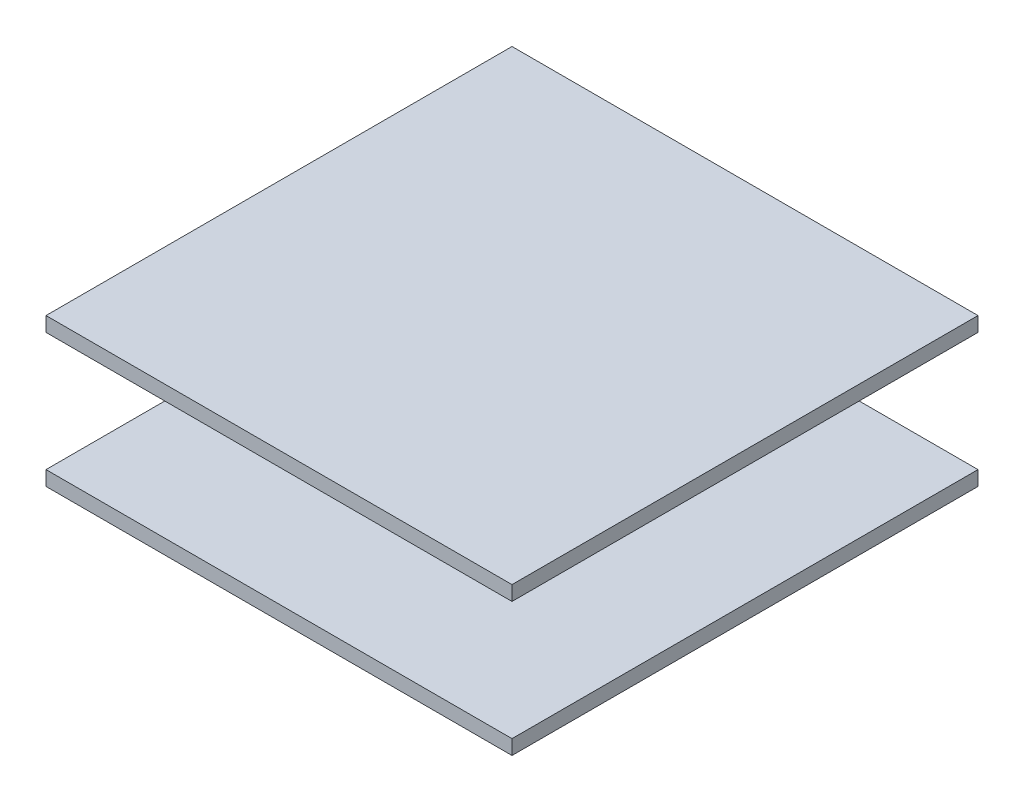
ISO-10303-21;
HEADER;
FILE_DESCRIPTION(('STEP AP214'),'2;1');
FILE_NAME('part.step','',(''),(''),'','','');
FILE_SCHEMA(('AUTOMOTIVE_DESIGN { 1 0 10303 214 1 1 1 1 }'));
ENDSEC;
DATA;
#1=APPLICATION_CONTEXT('core data for automotive mechanical design processes');
#2=APPLICATION_PROTOCOL_DEFINITION('international standard','automotive_design',2000,#1);
#3=PRODUCT_CONTEXT('',#1,'mechanical');
#4=PRODUCT('Part','Part','',(#3));
#5=PRODUCT_RELATED_PRODUCT_CATEGORY('part','',(#4));
#6=PRODUCT_DEFINITION_FORMATION('','',#4);
#7=PRODUCT_DEFINITION_CONTEXT('part definition',#1,'design');
#8=PRODUCT_DEFINITION('design','',#6,#7);
#9=PRODUCT_DEFINITION_SHAPE('','',#8);
#10=(LENGTH_UNIT() NAMED_UNIT(*) SI_UNIT(.MILLI.,.METRE.));
#11=(NAMED_UNIT(*) PLANE_ANGLE_UNIT() SI_UNIT($,.RADIAN.));
#12=(NAMED_UNIT(*) SI_UNIT($,.STERADIAN.) SOLID_ANGLE_UNIT());
#13=UNCERTAINTY_MEASURE_WITH_UNIT(LENGTH_MEASURE(1.E-05),#10,'distance_accuracy_value','');
#14=(GEOMETRIC_REPRESENTATION_CONTEXT(3) GLOBAL_UNCERTAINTY_ASSIGNED_CONTEXT((#13)) GLOBAL_UNIT_ASSIGNED_CONTEXT((#10,
#11,#12)) REPRESENTATION_CONTEXT('',''));
#15=CARTESIAN_POINT('',(0.,0.,0.));
#16=DIRECTION('',(0.,0.,1.));
#17=DIRECTION('',(1.,0.,0.));
#18=AXIS2_PLACEMENT_3D('',#15,#16,#17);
#19=CARTESIAN_POINT('',(-25.5,14.6,25.5));
#20=DIRECTION('',(0.,0.,-1.));
#21=DIRECTION('',(-1.,0.,0.));
#22=AXIS2_PLACEMENT_3D('',#19,#20,#21);
#23=PLANE('',#22);
#24=DIRECTION('',(1.,0.,0.));
#25=VECTOR('',#24,1.);
#26=CARTESIAN_POINT('',(-25.5,13.,25.5));
#27=LINE('',#26,#25);
#28=CARTESIAN_POINT('',(-25.5,13.,25.5));
#29=VERTEX_POINT('',#28);
#30=CARTESIAN_POINT('',(25.5,13.,25.5));
#31=VERTEX_POINT('',#30);
#32=EDGE_CURVE('E117',#29,#31,#27,.T.);
#33=ORIENTED_EDGE('',*,*,#32,.T.);
#34=DIRECTION('',(0.,-1.,0.));
#35=VECTOR('',#34,1.);
#36=CARTESIAN_POINT('',(25.5,14.6,25.5));
#37=LINE('',#36,#35);
#38=CARTESIAN_POINT('',(25.5,14.6,25.5));
#39=VERTEX_POINT('',#38);
#40=EDGE_CURVE('E12',#39,#31,#37,.T.);
#41=ORIENTED_EDGE('',*,*,#40,.F.);
#42=DIRECTION('',(1.,0.,0.));
#43=VECTOR('',#42,1.);
#44=CARTESIAN_POINT('',(-25.5,14.6,25.5));
#45=LINE('',#44,#43);
#46=CARTESIAN_POINT('',(-25.5,14.6,25.5));
#47=VERTEX_POINT('',#46);
#48=EDGE_CURVE('E101',#47,#39,#45,.T.);
#49=ORIENTED_EDGE('',*,*,#48,.F.);
#50=DIRECTION('',(0.,-1.,0.));
#51=VECTOR('',#50,1.);
#52=CARTESIAN_POINT('',(-25.5,14.6,25.5));
#53=LINE('',#52,#51);
#54=EDGE_CURVE('E113',#47,#29,#53,.T.);
#55=ORIENTED_EDGE('',*,*,#54,.T.);
#56=EDGE_LOOP('',(#33,#41,#49,#55));
#57=FACE_BOUND('',#56,.T.);
#58=ADVANCED_FACE('F49',(#57),#23,.F.);
#59=CARTESIAN_POINT('',(25.5,14.6,25.5));
#60=DIRECTION('',(-1.,0.,0.));
#61=DIRECTION('',(0.,0.,1.));
#62=AXIS2_PLACEMENT_3D('',#59,#60,#61);
#63=PLANE('',#62);
#64=DIRECTION('',(0.,0.,-1.));
#65=VECTOR('',#64,1.);
#66=CARTESIAN_POINT('',(25.5,13.,25.5));
#67=LINE('',#66,#65);
#68=CARTESIAN_POINT('',(25.5,13.,-25.5));
#69=VERTEX_POINT('',#68);
#70=EDGE_CURVE('E106',#31,#69,#67,.T.);
#71=ORIENTED_EDGE('',*,*,#70,.T.);
#72=DIRECTION('',(0.,-1.,0.));
#73=VECTOR('',#72,1.);
#74=CARTESIAN_POINT('',(25.5,14.6,-25.5));
#75=LINE('',#74,#73);
#76=CARTESIAN_POINT('',(25.5,14.6,-25.5));
#77=VERTEX_POINT('',#76);
#78=EDGE_CURVE('E58',#77,#69,#75,.T.);
#79=ORIENTED_EDGE('',*,*,#78,.F.);
#80=DIRECTION('',(0.,0.,-1.));
#81=VECTOR('',#80,1.);
#82=CARTESIAN_POINT('',(25.5,14.6,25.5));
#83=LINE('',#82,#81);
#84=EDGE_CURVE('E96',#39,#77,#83,.T.);
#85=ORIENTED_EDGE('',*,*,#84,.F.);
#86=ORIENTED_EDGE('',*,*,#40,.T.);
#87=EDGE_LOOP('',(#71,#79,#85,#86));
#88=FACE_BOUND('',#87,.T.);
#89=ADVANCED_FACE('F105',(#88),#63,.F.);
#90=CARTESIAN_POINT('',(25.5,14.6,-25.5));
#91=DIRECTION('',(0.,0.,1.));
#92=DIRECTION('',(1.,0.,0.));
#93=AXIS2_PLACEMENT_3D('',#90,#91,#92);
#94=PLANE('',#93);
#95=DIRECTION('',(-1.,0.,0.));
#96=VECTOR('',#95,1.);
#97=CARTESIAN_POINT('',(25.5,13.,-25.5));
#98=LINE('',#97,#96);
#99=CARTESIAN_POINT('',(-25.5,13.,-25.5));
#100=VERTEX_POINT('',#99);
#101=EDGE_CURVE('E83',#69,#100,#98,.T.);
#102=ORIENTED_EDGE('',*,*,#101,.T.);
#103=DIRECTION('',(0.,-1.,0.));
#104=VECTOR('',#103,1.);
#105=CARTESIAN_POINT('',(-25.5,14.6,-25.5));
#106=LINE('',#105,#104);
#107=CARTESIAN_POINT('',(-25.5,14.6,-25.5));
#108=VERTEX_POINT('',#107);
#109=EDGE_CURVE('E108',#108,#100,#106,.T.);
#110=ORIENTED_EDGE('',*,*,#109,.F.);
#111=DIRECTION('',(-1.,0.,0.));
#112=VECTOR('',#111,1.);
#113=CARTESIAN_POINT('',(25.5,14.6,-25.5));
#114=LINE('',#113,#112);
#115=EDGE_CURVE('E99',#77,#108,#114,.T.);
#116=ORIENTED_EDGE('',*,*,#115,.F.);
#117=ORIENTED_EDGE('',*,*,#78,.T.);
#118=EDGE_LOOP('',(#102,#110,#116,#117));
#119=FACE_BOUND('',#118,.T.);
#120=ADVANCED_FACE('F109',(#119),#94,.F.);
#121=CARTESIAN_POINT('',(-25.5,14.6,-25.5));
#122=DIRECTION('',(1.,0.,0.));
#123=DIRECTION('',(0.,0.,-1.));
#124=AXIS2_PLACEMENT_3D('',#121,#122,#123);
#125=PLANE('',#124);
#126=DIRECTION('',(0.,0.,1.));
#127=VECTOR('',#126,1.);
#128=CARTESIAN_POINT('',(-25.5,13.,-25.5));
#129=LINE('',#128,#127);
#130=EDGE_CURVE('E89',#100,#29,#129,.T.);
#131=ORIENTED_EDGE('',*,*,#130,.T.);
#132=ORIENTED_EDGE('',*,*,#54,.F.);
#133=DIRECTION('',(0.,0.,1.));
#134=VECTOR('',#133,1.);
#135=CARTESIAN_POINT('',(-25.5,14.6,-25.5));
#136=LINE('',#135,#134);
#137=EDGE_CURVE('E66',#108,#47,#136,.T.);
#138=ORIENTED_EDGE('',*,*,#137,.F.);
#139=ORIENTED_EDGE('',*,*,#109,.T.);
#140=EDGE_LOOP('',(#131,#132,#138,#139));
#141=FACE_BOUND('',#140,.T.);
#142=ADVANCED_FACE('F130',(#141),#125,.F.);
#143=CARTESIAN_POINT('',(0.,14.6,0.));
#144=DIRECTION('',(0.,1.,0.));
#145=DIRECTION('',(0.,0.,1.));
#146=AXIS2_PLACEMENT_3D('',#143,#144,#145);
#147=PLANE('',#146);
#148=ORIENTED_EDGE('',*,*,#48,.T.);
#149=ORIENTED_EDGE('',*,*,#84,.T.);
#150=ORIENTED_EDGE('',*,*,#115,.T.);
#151=ORIENTED_EDGE('',*,*,#137,.T.);
#152=EDGE_LOOP('',(#148,#149,#150,#151));
#153=FACE_BOUND('',#152,.T.);
#154=ADVANCED_FACE('F97',(#153),#147,.T.);
#155=CARTESIAN_POINT('',(0.,13.,0.));
#156=DIRECTION('',(0.,1.,0.));
#157=DIRECTION('',(0.,0.,1.));
#158=AXIS2_PLACEMENT_3D('',#155,#156,#157);
#159=PLANE('',#158);
#160=ORIENTED_EDGE('',*,*,#32,.F.);
#161=ORIENTED_EDGE('',*,*,#130,.F.);
#162=ORIENTED_EDGE('',*,*,#101,.F.);
#163=ORIENTED_EDGE('',*,*,#70,.F.);
#164=EDGE_LOOP('',(#160,#161,#162,#163));
#165=FACE_BOUND('',#164,.T.);
#166=ADVANCED_FACE('F133',(#165),#159,.F.);
#167=CLOSED_SHELL('',(#58,#89,#120,#142,#154,#166));
#168=MANIFOLD_SOLID_BREP('B2',#167);
#169=CARTESIAN_POINT('',(25.5,-1.6,25.5));
#170=DIRECTION('',(1.,0.,0.));
#171=DIRECTION('',(0.,0.,-1.));
#172=AXIS2_PLACEMENT_3D('',#169,#170,#171);
#173=PLANE('',#172);
#174=DIRECTION('',(0.,0.,-1.));
#175=VECTOR('',#174,1.);
#176=CARTESIAN_POINT('',(25.5,0.,25.5));
#177=LINE('',#176,#175);
#178=CARTESIAN_POINT('',(25.5,0.,25.5));
#179=VERTEX_POINT('',#178);
#180=CARTESIAN_POINT('',(25.5,0.,-25.5));
#181=VERTEX_POINT('',#180);
#182=EDGE_CURVE('E249',#179,#181,#177,.T.);
#183=ORIENTED_EDGE('',*,*,#182,.F.);
#184=DIRECTION('',(0.,1.,0.));
#185=VECTOR('',#184,1.);
#186=CARTESIAN_POINT('',(25.5,-1.6,25.5));
#187=LINE('',#186,#185);
#188=CARTESIAN_POINT('',(25.5,-1.6,25.5));
#189=VERTEX_POINT('',#188);
#190=EDGE_CURVE('E47',#189,#179,#187,.T.);
#191=ORIENTED_EDGE('',*,*,#190,.F.);
#192=DIRECTION('',(0.,0.,-1.));
#193=VECTOR('',#192,1.);
#194=CARTESIAN_POINT('',(25.5,-1.6,25.5));
#195=LINE('',#194,#193);
#196=CARTESIAN_POINT('',(25.5,-1.6,-25.5));
#197=VERTEX_POINT('',#196);
#198=EDGE_CURVE('E243',#189,#197,#195,.T.);
#199=ORIENTED_EDGE('',*,*,#198,.T.);
#200=DIRECTION('',(0.,1.,0.));
#201=VECTOR('',#200,1.);
#202=CARTESIAN_POINT('',(25.5,-1.6,-25.5));
#203=LINE('',#202,#201);
#204=EDGE_CURVE('E188',#197,#181,#203,.T.);
#205=ORIENTED_EDGE('',*,*,#204,.T.);
#206=EDGE_LOOP('',(#183,#191,#199,#205));
#207=FACE_BOUND('',#206,.T.);
#208=ADVANCED_FACE('F185',(#207),#173,.T.);
#209=CARTESIAN_POINT('',(-25.5,-1.6,25.5));
#210=DIRECTION('',(0.,0.,1.));
#211=DIRECTION('',(1.,0.,0.));
#212=AXIS2_PLACEMENT_3D('',#209,#210,#211);
#213=PLANE('',#212);
#214=DIRECTION('',(1.,0.,0.));
#215=VECTOR('',#214,1.);
#216=CARTESIAN_POINT('',(-25.5,0.,25.5));
#217=LINE('',#216,#215);
#218=CARTESIAN_POINT('',(-25.5,0.,25.5));
#219=VERTEX_POINT('',#218);
#220=EDGE_CURVE('E245',#219,#179,#217,.T.);
#221=ORIENTED_EDGE('',*,*,#220,.F.);
#222=DIRECTION('',(0.,1.,0.));
#223=VECTOR('',#222,1.);
#224=CARTESIAN_POINT('',(-25.5,-1.6,25.5));
#225=LINE('',#224,#223);
#226=CARTESIAN_POINT('',(-25.5,-1.6,25.5));
#227=VERTEX_POINT('',#226);
#228=EDGE_CURVE('E194',#227,#219,#225,.T.);
#229=ORIENTED_EDGE('',*,*,#228,.F.);
#230=DIRECTION('',(1.,0.,0.));
#231=VECTOR('',#230,1.);
#232=CARTESIAN_POINT('',(-25.5,-1.6,25.5));
#233=LINE('',#232,#231);
#234=EDGE_CURVE('E240',#227,#189,#233,.T.);
#235=ORIENTED_EDGE('',*,*,#234,.T.);
#236=ORIENTED_EDGE('',*,*,#190,.T.);
#237=EDGE_LOOP('',(#221,#229,#235,#236));
#238=FACE_BOUND('',#237,.T.);
#239=ADVANCED_FACE('F259',(#238),#213,.T.);
#240=CARTESIAN_POINT('',(-25.5,-1.6,25.5));
#241=DIRECTION('',(-1.,0.,0.));
#242=DIRECTION('',(0.,0.,1.));
#243=AXIS2_PLACEMENT_3D('',#240,#241,#242);
#244=PLANE('',#243);
#245=DIRECTION('',(0.,0.,1.));
#246=VECTOR('',#245,1.);
#247=CARTESIAN_POINT('',(-25.5,0.,25.5));
#248=LINE('',#247,#246);
#249=CARTESIAN_POINT('',(-25.5,0.,-25.5));
#250=VERTEX_POINT('',#249);
#251=EDGE_CURVE('E235',#250,#219,#248,.T.);
#252=ORIENTED_EDGE('',*,*,#251,.F.);
#253=DIRECTION('',(0.,1.,0.));
#254=VECTOR('',#253,1.);
#255=CARTESIAN_POINT('',(-25.5,-1.6,-25.5));
#256=LINE('',#255,#254);
#257=CARTESIAN_POINT('',(-25.5,-1.6,-25.5));
#258=VERTEX_POINT('',#257);
#259=EDGE_CURVE('E230',#258,#250,#256,.T.);
#260=ORIENTED_EDGE('',*,*,#259,.F.);
#261=DIRECTION('',(0.,0.,1.));
#262=VECTOR('',#261,1.);
#263=CARTESIAN_POINT('',(-25.5,-1.6,25.5));
#264=LINE('',#263,#262);
#265=EDGE_CURVE('E233',#258,#227,#264,.T.);
#266=ORIENTED_EDGE('',*,*,#265,.T.);
#267=ORIENTED_EDGE('',*,*,#228,.T.);
#268=EDGE_LOOP('',(#252,#260,#266,#267));
#269=FACE_BOUND('',#268,.T.);
#270=ADVANCED_FACE('F232',(#269),#244,.T.);
#271=CARTESIAN_POINT('',(-25.5,-1.6,-25.5));
#272=DIRECTION('',(0.,0.,-1.));
#273=DIRECTION('',(-1.,0.,0.));
#274=AXIS2_PLACEMENT_3D('',#271,#272,#273);
#275=PLANE('',#274);
#276=DIRECTION('',(-1.,0.,0.));
#277=VECTOR('',#276,1.);
#278=CARTESIAN_POINT('',(-25.5,0.,-25.5));
#279=LINE('',#278,#277);
#280=EDGE_CURVE('E252',#181,#250,#279,.T.);
#281=ORIENTED_EDGE('',*,*,#280,.F.);
#282=ORIENTED_EDGE('',*,*,#204,.F.);
#283=DIRECTION('',(-1.,0.,0.));
#284=VECTOR('',#283,1.);
#285=CARTESIAN_POINT('',(-25.5,-1.6,-25.5));
#286=LINE('',#285,#284);
#287=EDGE_CURVE('E239',#197,#258,#286,.T.);
#288=ORIENTED_EDGE('',*,*,#287,.T.);
#289=ORIENTED_EDGE('',*,*,#259,.T.);
#290=EDGE_LOOP('',(#281,#282,#288,#289));
#291=FACE_BOUND('',#290,.T.);
#292=ADVANCED_FACE('F242',(#291),#275,.T.);
#293=CARTESIAN_POINT('',(0.,-1.6,0.));
#294=DIRECTION('',(0.,-1.,0.));
#295=DIRECTION('',(0.,0.,-1.));
#296=AXIS2_PLACEMENT_3D('',#293,#294,#295);
#297=PLANE('',#296);
#298=ORIENTED_EDGE('',*,*,#198,.F.);
#299=ORIENTED_EDGE('',*,*,#234,.F.);
#300=ORIENTED_EDGE('',*,*,#265,.F.);
#301=ORIENTED_EDGE('',*,*,#287,.F.);
#302=EDGE_LOOP('',(#298,#299,#300,#301));
#303=FACE_BOUND('',#302,.T.);
#304=ADVANCED_FACE('F238',(#303),#297,.T.);
#305=CARTESIAN_POINT('',(0.,0.,0.));
#306=DIRECTION('',(0.,-1.,0.));
#307=DIRECTION('',(0.,0.,-1.));
#308=AXIS2_PLACEMENT_3D('',#305,#306,#307);
#309=PLANE('',#308);
#310=ORIENTED_EDGE('',*,*,#182,.T.);
#311=ORIENTED_EDGE('',*,*,#280,.T.);
#312=ORIENTED_EDGE('',*,*,#251,.T.);
#313=ORIENTED_EDGE('',*,*,#220,.T.);
#314=EDGE_LOOP('',(#310,#311,#312,#313));
#315=FACE_BOUND('',#314,.T.);
#316=ADVANCED_FACE('F258',(#315),#309,.F.);
#317=CLOSED_SHELL('',(#208,#239,#270,#292,#304,#316));
#318=MANIFOLD_SOLID_BREP('B6',#317);
#319=ADVANCED_BREP_SHAPE_REPRESENTATION('',(#18,#168,#318),#14);
#320=SHAPE_DEFINITION_REPRESENTATION(#9,#319);
ENDSEC;
END-ISO-10303-21;
